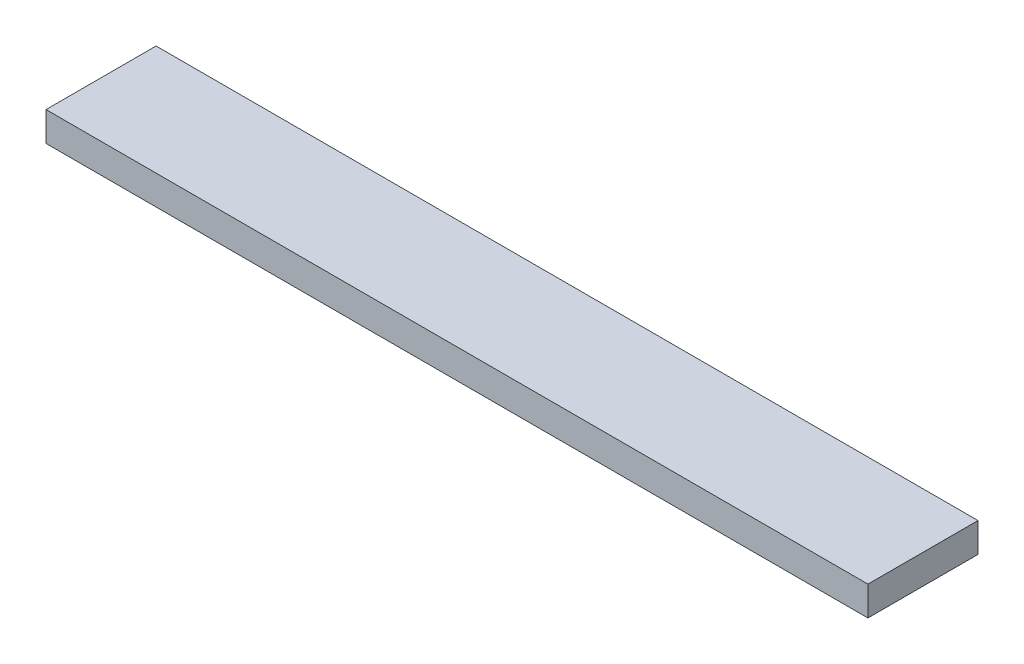
ISO-10303-21;
HEADER;
FILE_DESCRIPTION(('STEP AP214'),'2;1');
FILE_NAME('part.step','',(''),(''),'','','');
FILE_SCHEMA(('AUTOMOTIVE_DESIGN { 1 0 10303 214 1 1 1 1 }'));
ENDSEC;
DATA;
#1=APPLICATION_CONTEXT('core data for automotive mechanical design processes');
#2=APPLICATION_PROTOCOL_DEFINITION('international standard','automotive_design',2000,#1);
#3=PRODUCT_CONTEXT('',#1,'mechanical');
#4=PRODUCT('Part','Part','',(#3));
#5=PRODUCT_RELATED_PRODUCT_CATEGORY('part','',(#4));
#6=PRODUCT_DEFINITION_FORMATION('','',#4);
#7=PRODUCT_DEFINITION_CONTEXT('part definition',#1,'design');
#8=PRODUCT_DEFINITION('design','',#6,#7);
#9=PRODUCT_DEFINITION_SHAPE('','',#8);
#10=(LENGTH_UNIT() NAMED_UNIT(*) SI_UNIT(.MILLI.,.METRE.));
#11=(NAMED_UNIT(*) PLANE_ANGLE_UNIT() SI_UNIT($,.RADIAN.));
#12=(NAMED_UNIT(*) SI_UNIT($,.STERADIAN.) SOLID_ANGLE_UNIT());
#13=UNCERTAINTY_MEASURE_WITH_UNIT(LENGTH_MEASURE(1.E-05),#10,'distance_accuracy_value','');
#14=(GEOMETRIC_REPRESENTATION_CONTEXT(3) GLOBAL_UNCERTAINTY_ASSIGNED_CONTEXT((#13)) GLOBAL_UNIT_ASSIGNED_CONTEXT((#10,
#11,#12)) REPRESENTATION_CONTEXT('',''));
#15=CARTESIAN_POINT('',(0.,0.,0.));
#16=DIRECTION('',(0.,0.,1.));
#17=DIRECTION('',(1.,0.,0.));
#18=AXIS2_PLACEMENT_3D('',#15,#16,#17);
#19=CARTESIAN_POINT('',(56.,4.,7.5));
#20=DIRECTION('',(-1.,0.,0.));
#21=DIRECTION('',(0.,0.,1.));
#22=AXIS2_PLACEMENT_3D('',#19,#20,#21);
#23=PLANE('',#22);
#24=DIRECTION('',(0.,0.,-1.));
#25=VECTOR('',#24,1.);
#26=CARTESIAN_POINT('',(56.,0.,7.5));
#27=LINE('',#26,#25);
#28=CARTESIAN_POINT('',(56.,0.,7.5));
#29=VERTEX_POINT('',#28);
#30=CARTESIAN_POINT('',(56.,0.,-7.5));
#31=VERTEX_POINT('',#30);
#32=EDGE_CURVE('E98',#29,#31,#27,.T.);
#33=ORIENTED_EDGE('',*,*,#32,.T.);
#34=DIRECTION('',(0.,-1.,0.));
#35=VECTOR('',#34,1.);
#36=CARTESIAN_POINT('',(56.,4.,-7.5));
#37=LINE('',#36,#35);
#38=CARTESIAN_POINT('',(56.,4.,-7.5));
#39=VERTEX_POINT('',#38);
#40=EDGE_CURVE('E11',#39,#31,#37,.T.);
#41=ORIENTED_EDGE('',*,*,#40,.F.);
#42=DIRECTION('',(0.,0.,-1.));
#43=VECTOR('',#42,1.);
#44=CARTESIAN_POINT('',(56.,4.,7.5));
#45=LINE('',#44,#43);
#46=CARTESIAN_POINT('',(56.,4.,7.5));
#47=VERTEX_POINT('',#46);
#48=EDGE_CURVE('E86',#47,#39,#45,.T.);
#49=ORIENTED_EDGE('',*,*,#48,.F.);
#50=DIRECTION('',(0.,-1.,0.));
#51=VECTOR('',#50,1.);
#52=CARTESIAN_POINT('',(56.,4.,7.5));
#53=LINE('',#52,#51);
#54=EDGE_CURVE('E94',#47,#29,#53,.T.);
#55=ORIENTED_EDGE('',*,*,#54,.T.);
#56=EDGE_LOOP('',(#33,#41,#49,#55));
#57=FACE_BOUND('',#56,.T.);
#58=ADVANCED_FACE('F35',(#57),#23,.F.);
#59=CARTESIAN_POINT('',(-56.,4.,-7.5));
#60=DIRECTION('',(0.,0.,1.));
#61=DIRECTION('',(1.,0.,0.));
#62=AXIS2_PLACEMENT_3D('',#59,#60,#61);
#63=PLANE('',#62);
#64=DIRECTION('',(-1.,0.,0.));
#65=VECTOR('',#64,1.);
#66=CARTESIAN_POINT('',(-56.,0.,-7.5));
#67=LINE('',#66,#65);
#68=CARTESIAN_POINT('',(-56.,0.,-7.5));
#69=VERTEX_POINT('',#68);
#70=EDGE_CURVE('E90',#31,#69,#67,.T.);
#71=ORIENTED_EDGE('',*,*,#70,.T.);
#72=DIRECTION('',(0.,-1.,0.));
#73=VECTOR('',#72,1.);
#74=CARTESIAN_POINT('',(-56.,4.,-7.5));
#75=LINE('',#74,#73);
#76=CARTESIAN_POINT('',(-56.,4.,-7.5));
#77=VERTEX_POINT('',#76);
#78=EDGE_CURVE('E43',#77,#69,#75,.T.);
#79=ORIENTED_EDGE('',*,*,#78,.F.);
#80=DIRECTION('',(-1.,0.,0.));
#81=VECTOR('',#80,1.);
#82=CARTESIAN_POINT('',(-56.,4.,-7.5));
#83=LINE('',#82,#81);
#84=EDGE_CURVE('E81',#39,#77,#83,.T.);
#85=ORIENTED_EDGE('',*,*,#84,.F.);
#86=ORIENTED_EDGE('',*,*,#40,.T.);
#87=EDGE_LOOP('',(#71,#79,#85,#86));
#88=FACE_BOUND('',#87,.T.);
#89=ADVANCED_FACE('F89',(#88),#63,.F.);
#90=CARTESIAN_POINT('',(-56.,4.,7.5));
#91=DIRECTION('',(1.,0.,0.));
#92=DIRECTION('',(0.,0.,-1.));
#93=AXIS2_PLACEMENT_3D('',#90,#91,#92);
#94=PLANE('',#93);
#95=DIRECTION('',(0.,0.,1.));
#96=VECTOR('',#95,1.);
#97=CARTESIAN_POINT('',(-56.,0.,7.5));
#98=LINE('',#97,#96);
#99=CARTESIAN_POINT('',(-56.,0.,7.5));
#100=VERTEX_POINT('',#99);
#101=EDGE_CURVE('E68',#69,#100,#98,.T.);
#102=ORIENTED_EDGE('',*,*,#101,.T.);
#103=DIRECTION('',(0.,-1.,0.));
#104=VECTOR('',#103,1.);
#105=CARTESIAN_POINT('',(-56.,4.,7.5));
#106=LINE('',#105,#104);
#107=CARTESIAN_POINT('',(-56.,4.,7.5));
#108=VERTEX_POINT('',#107);
#109=EDGE_CURVE('E91',#108,#100,#106,.T.);
#110=ORIENTED_EDGE('',*,*,#109,.F.);
#111=DIRECTION('',(0.,0.,1.));
#112=VECTOR('',#111,1.);
#113=CARTESIAN_POINT('',(-56.,4.,7.5));
#114=LINE('',#113,#112);
#115=EDGE_CURVE('E84',#77,#108,#114,.T.);
#116=ORIENTED_EDGE('',*,*,#115,.F.);
#117=ORIENTED_EDGE('',*,*,#78,.T.);
#118=EDGE_LOOP('',(#102,#110,#116,#117));
#119=FACE_BOUND('',#118,.T.);
#120=ADVANCED_FACE('F92',(#119),#94,.F.);
#121=CARTESIAN_POINT('',(-56.,4.,7.5));
#122=DIRECTION('',(0.,0.,-1.));
#123=DIRECTION('',(-1.,0.,0.));
#124=AXIS2_PLACEMENT_3D('',#121,#122,#123);
#125=PLANE('',#124);
#126=DIRECTION('',(1.,0.,0.));
#127=VECTOR('',#126,1.);
#128=CARTESIAN_POINT('',(-56.,0.,7.5));
#129=LINE('',#128,#127);
#130=EDGE_CURVE('E74',#100,#29,#129,.T.);
#131=ORIENTED_EDGE('',*,*,#130,.T.);
#132=ORIENTED_EDGE('',*,*,#54,.F.);
#133=DIRECTION('',(1.,0.,0.));
#134=VECTOR('',#133,1.);
#135=CARTESIAN_POINT('',(-56.,4.,7.5));
#136=LINE('',#135,#134);
#137=EDGE_CURVE('E51',#108,#47,#136,.T.);
#138=ORIENTED_EDGE('',*,*,#137,.F.);
#139=ORIENTED_EDGE('',*,*,#109,.T.);
#140=EDGE_LOOP('',(#131,#132,#138,#139));
#141=FACE_BOUND('',#140,.T.);
#142=ADVANCED_FACE('F105',(#141),#125,.F.);
#143=CARTESIAN_POINT('',(0.,4.,0.));
#144=DIRECTION('',(0.,-1.,0.));
#145=DIRECTION('',(0.,0.,-1.));
#146=AXIS2_PLACEMENT_3D('',#143,#144,#145);
#147=PLANE('',#146);
#148=ORIENTED_EDGE('',*,*,#48,.T.);
#149=ORIENTED_EDGE('',*,*,#84,.T.);
#150=ORIENTED_EDGE('',*,*,#115,.T.);
#151=ORIENTED_EDGE('',*,*,#137,.T.);
#152=EDGE_LOOP('',(#148,#149,#150,#151));
#153=FACE_BOUND('',#152,.T.);
#154=ADVANCED_FACE('F82',(#153),#147,.F.);
#155=CARTESIAN_POINT('',(0.,0.,0.));
#156=DIRECTION('',(0.,-1.,0.));
#157=DIRECTION('',(0.,0.,-1.));
#158=AXIS2_PLACEMENT_3D('',#155,#156,#157);
#159=PLANE('',#158);
#160=ORIENTED_EDGE('',*,*,#32,.F.);
#161=ORIENTED_EDGE('',*,*,#130,.F.);
#162=ORIENTED_EDGE('',*,*,#101,.F.);
#163=ORIENTED_EDGE('',*,*,#70,.F.);
#164=EDGE_LOOP('',(#160,#161,#162,#163));
#165=FACE_BOUND('',#164,.T.);
#166=ADVANCED_FACE('F108',(#165),#159,.T.);
#167=CLOSED_SHELL('',(#58,#89,#120,#142,#154,#166));
#168=MANIFOLD_SOLID_BREP('B2',#167);
#169=ADVANCED_BREP_SHAPE_REPRESENTATION('',(#18,#168),#14);
#170=SHAPE_DEFINITION_REPRESENTATION(#9,#169);
ENDSEC;
END-ISO-10303-21;
